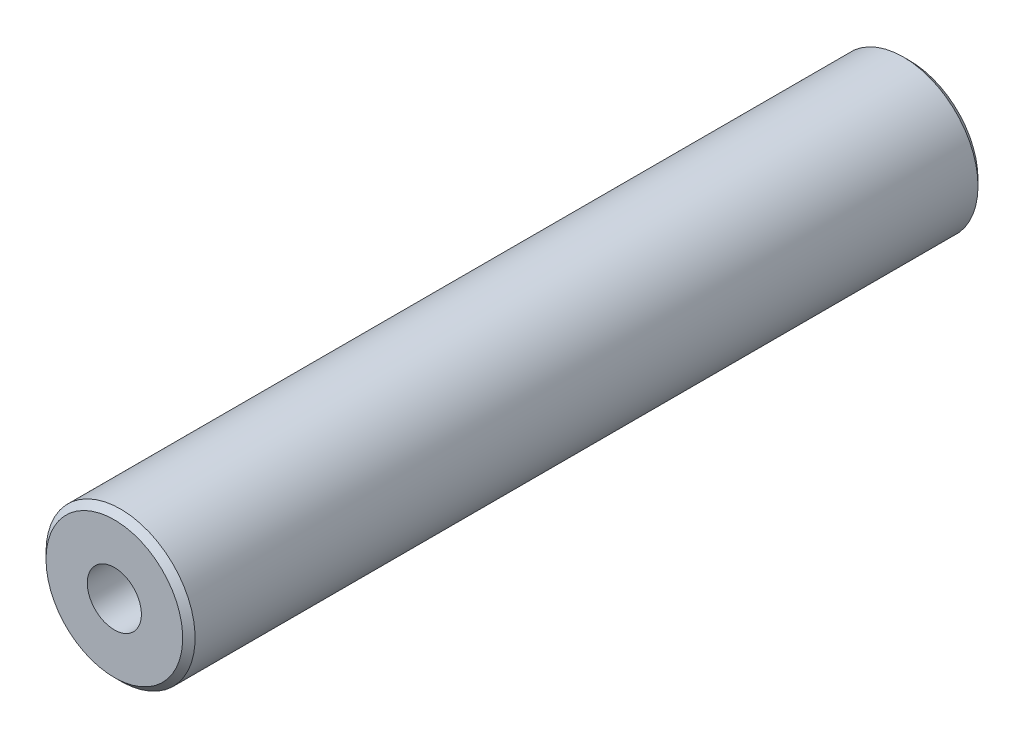
ISO-10303-21;
HEADER;
FILE_DESCRIPTION(('STEP AP214'),'2;1');
FILE_NAME('part.step','',(''),(''),'','','');
FILE_SCHEMA(('AUTOMOTIVE_DESIGN { 1 0 10303 214 1 1 1 1 }'));
ENDSEC;
DATA;
#1=APPLICATION_CONTEXT('core data for automotive mechanical design processes');
#2=APPLICATION_PROTOCOL_DEFINITION('international standard','automotive_design',2000,#1);
#3=PRODUCT_CONTEXT('',#1,'mechanical');
#4=PRODUCT('Part','Part','',(#3));
#5=PRODUCT_RELATED_PRODUCT_CATEGORY('part','',(#4));
#6=PRODUCT_DEFINITION_FORMATION('','',#4);
#7=PRODUCT_DEFINITION_CONTEXT('part definition',#1,'design');
#8=PRODUCT_DEFINITION('design','',#6,#7);
#9=PRODUCT_DEFINITION_SHAPE('','',#8);
#10=(LENGTH_UNIT() NAMED_UNIT(*) SI_UNIT(.MILLI.,.METRE.));
#11=(NAMED_UNIT(*) PLANE_ANGLE_UNIT() SI_UNIT($,.RADIAN.));
#12=(NAMED_UNIT(*) SI_UNIT($,.STERADIAN.) SOLID_ANGLE_UNIT());
#13=UNCERTAINTY_MEASURE_WITH_UNIT(LENGTH_MEASURE(1.E-05),#10,'distance_accuracy_value','');
#14=(GEOMETRIC_REPRESENTATION_CONTEXT(3) GLOBAL_UNCERTAINTY_ASSIGNED_CONTEXT((#13)) GLOBAL_UNIT_ASSIGNED_CONTEXT((#10,
#11,#12)) REPRESENTATION_CONTEXT('',''));
#15=CARTESIAN_POINT('',(0.,0.,0.));
#16=DIRECTION('',(0.,0.,1.));
#17=DIRECTION('',(1.,0.,0.));
#18=AXIS2_PLACEMENT_3D('',#15,#16,#17);
#19=CARTESIAN_POINT('',(0.,0.,25.4));
#20=DIRECTION('',(0.,0.,-1.));
#21=DIRECTION('',(-1.,0.,0.));
#22=AXIS2_PLACEMENT_3D('',#19,#20,#21);
#23=CYLINDRICAL_SURFACE('',#22,4.7625);
#24=CARTESIAN_POINT('',(0.,0.,-25.003125));
#25=DIRECTION('',(0.,0.,1.));
#26=DIRECTION('',(1.,0.,0.));
#27=AXIS2_PLACEMENT_3D('',#24,#25,#26);
#28=CIRCLE('',#27,4.7625);
#29=CARTESIAN_POINT('',(4.7625,0.,-25.003125));
#30=VERTEX_POINT('',#29);
#31=EDGE_CURVE('E73',#30,#30,#28,.T.);
#32=ORIENTED_EDGE('',*,*,#31,.T.);
#33=EDGE_LOOP('',(#32));
#34=FACE_BOUND('',#33,.T.);
#35=CARTESIAN_POINT('',(0.,0.,25.003125));
#36=DIRECTION('',(0.,0.,1.));
#37=DIRECTION('',(1.,0.,0.));
#38=AXIS2_PLACEMENT_3D('',#35,#36,#37);
#39=CIRCLE('',#38,4.7625);
#40=CARTESIAN_POINT('',(-4.7625,0.,25.003125));
#41=VERTEX_POINT('',#40);
#42=EDGE_CURVE('E70',#41,#41,#39,.F.);
#43=ORIENTED_EDGE('',*,*,#42,.T.);
#44=EDGE_LOOP('',(#43));
#45=FACE_BOUND('',#44,.T.);
#46=ADVANCED_FACE('F35',(#34,#45),#23,.T.);
#47=CARTESIAN_POINT('',(0.,0.,25.4));
#48=DIRECTION('',(0.,0.,1.));
#49=DIRECTION('',(1.,0.,0.));
#50=AXIS2_PLACEMENT_3D('',#47,#48,#49);
#51=PLANE('',#50);
#52=CARTESIAN_POINT('',(0.,0.,25.4));
#53=DIRECTION('',(0.,0.,1.));
#54=DIRECTION('',(1.,0.,0.));
#55=AXIS2_PLACEMENT_3D('',#52,#53,#54);
#56=CIRCLE('',#55,4.365625);
#57=CARTESIAN_POINT('',(-4.36562500000001,0.,25.4));
#58=VERTEX_POINT('',#57);
#59=EDGE_CURVE('E11',#58,#58,#56,.T.);
#60=ORIENTED_EDGE('',*,*,#59,.T.);
#61=EDGE_LOOP('',(#60));
#62=FACE_BOUND('',#61,.T.);
#63=CARTESIAN_POINT('',(0.,0.,25.4));
#64=DIRECTION('',(0.,0.,1.));
#65=DIRECTION('',(1.,0.,0.));
#66=AXIS2_PLACEMENT_3D('',#63,#64,#65);
#67=CIRCLE('',#66,1.72719999999999);
#68=CARTESIAN_POINT('',(1.72719999999999,0.,25.4));
#69=VERTEX_POINT('',#68);
#70=EDGE_CURVE('E60',#69,#69,#67,.T.);
#71=ORIENTED_EDGE('',*,*,#70,.F.);
#72=EDGE_LOOP('',(#71));
#73=FACE_BOUND('',#72,.T.);
#74=ADVANCED_FACE('F88',(#62,#73),#51,.T.);
#75=CARTESIAN_POINT('',(0.,0.,-25.4));
#76=DIRECTION('',(0.,0.,1.));
#77=DIRECTION('',(1.,0.,0.));
#78=AXIS2_PLACEMENT_3D('',#75,#76,#77);
#79=PLANE('',#78);
#80=CARTESIAN_POINT('',(0.,0.,-25.4));
#81=DIRECTION('',(0.,0.,1.));
#82=DIRECTION('',(1.,0.,0.));
#83=AXIS2_PLACEMENT_3D('',#80,#81,#82);
#84=CIRCLE('',#83,4.365625);
#85=CARTESIAN_POINT('',(4.365625,0.,-25.4));
#86=VERTEX_POINT('',#85);
#87=EDGE_CURVE('E43',#86,#86,#84,.F.);
#88=ORIENTED_EDGE('',*,*,#87,.T.);
#89=EDGE_LOOP('',(#88));
#90=FACE_BOUND('',#89,.T.);
#91=CARTESIAN_POINT('',(0.,0.,-25.4));
#92=DIRECTION('',(0.,0.,-1.));
#93=DIRECTION('',(-1.,0.,0.));
#94=AXIS2_PLACEMENT_3D('',#91,#92,#93);
#95=CIRCLE('',#94,1.72719999999999);
#96=CARTESIAN_POINT('',(-1.72719999999999,0.,-25.4));
#97=VERTEX_POINT('',#96);
#98=EDGE_CURVE('E59',#97,#97,#95,.T.);
#99=ORIENTED_EDGE('',*,*,#98,.F.);
#100=EDGE_LOOP('',(#99));
#101=FACE_BOUND('',#100,.T.);
#102=ADVANCED_FACE('F78',(#90,#101),#79,.F.);
#103=CARTESIAN_POINT('',(0.,0.,-19.05));
#104=DIRECTION('',(0.,0.,-1.));
#105=DIRECTION('',(-1.,0.,0.));
#106=AXIS2_PLACEMENT_3D('',#103,#104,#105);
#107=CONICAL_SURFACE('',#106,1.72719999999999,1.02974425867665);
#108=CARTESIAN_POINT('',(0.,0.,-18.0121935388156));
#109=VERTEX_POINT('',#108);
#110=VERTEX_LOOP('',#109);
#111=FACE_BOUND('',#110,.T.);
#112=CARTESIAN_POINT('',(0.,0.,-19.05));
#113=DIRECTION('',(0.,0.,-1.));
#114=DIRECTION('',(-1.,0.,0.));
#115=AXIS2_PLACEMENT_3D('',#112,#113,#114);
#116=CIRCLE('',#115,1.72719999999999);
#117=CARTESIAN_POINT('',(-1.72719999999999,0.,-19.05));
#118=VERTEX_POINT('',#117);
#119=EDGE_CURVE('E63',#118,#118,#116,.T.);
#120=ORIENTED_EDGE('',*,*,#119,.T.);
#121=EDGE_LOOP('',(#120));
#122=FACE_BOUND('',#121,.T.);
#123=ADVANCED_FACE('F108',(#111,#122),#107,.F.);
#124=CARTESIAN_POINT('',(0.,0.,-25.4));
#125=DIRECTION('',(0.,0.,-1.));
#126=DIRECTION('',(-1.,0.,0.));
#127=AXIS2_PLACEMENT_3D('',#124,#125,#126);
#128=CYLINDRICAL_SURFACE('',#127,1.72719999999999);
#129=ORIENTED_EDGE('',*,*,#119,.F.);
#130=EDGE_LOOP('',(#129));
#131=FACE_BOUND('',#130,.T.);
#132=ORIENTED_EDGE('',*,*,#98,.T.);
#133=EDGE_LOOP('',(#132));
#134=FACE_BOUND('',#133,.T.);
#135=ADVANCED_FACE('F53',(#131,#134),#128,.F.);
#136=CARTESIAN_POINT('',(0.,0.,19.05));
#137=DIRECTION('',(0.,0.,1.));
#138=DIRECTION('',(1.,0.,0.));
#139=AXIS2_PLACEMENT_3D('',#136,#137,#138);
#140=CONICAL_SURFACE('',#139,1.72719999999999,1.02974425867665);
#141=CARTESIAN_POINT('',(0.,0.,18.0121935388156));
#142=VERTEX_POINT('',#141);
#143=VERTEX_LOOP('',#142);
#144=FACE_BOUND('',#143,.T.);
#145=CARTESIAN_POINT('',(0.,0.,19.05));
#146=DIRECTION('',(0.,0.,1.));
#147=DIRECTION('',(1.,0.,0.));
#148=AXIS2_PLACEMENT_3D('',#145,#146,#147);
#149=CIRCLE('',#148,1.72719999999999);
#150=CARTESIAN_POINT('',(1.72719999999999,0.,19.05));
#151=VERTEX_POINT('',#150);
#152=EDGE_CURVE('E57',#151,#151,#149,.T.);
#153=ORIENTED_EDGE('',*,*,#152,.T.);
#154=EDGE_LOOP('',(#153));
#155=FACE_BOUND('',#154,.T.);
#156=ADVANCED_FACE('F49',(#144,#155),#140,.F.);
#157=CARTESIAN_POINT('',(0.,0.,25.4));
#158=DIRECTION('',(0.,0.,1.));
#159=DIRECTION('',(1.,0.,0.));
#160=AXIS2_PLACEMENT_3D('',#157,#158,#159);
#161=CYLINDRICAL_SURFACE('',#160,1.72719999999999);
#162=ORIENTED_EDGE('',*,*,#152,.F.);
#163=EDGE_LOOP('',(#162));
#164=FACE_BOUND('',#163,.T.);
#165=ORIENTED_EDGE('',*,*,#70,.T.);
#166=EDGE_LOOP('',(#165));
#167=FACE_BOUND('',#166,.T.);
#168=ADVANCED_FACE('F52',(#164,#167),#161,.F.);
#169=CARTESIAN_POINT('',(0.,0.,-25.003125));
#170=DIRECTION('',(0.,0.,1.));
#171=DIRECTION('',(1.,0.,0.));
#172=AXIS2_PLACEMENT_3D('',#169,#170,#171);
#173=CONICAL_SURFACE('',#172,4.7625,0.785398163397454);
#174=ORIENTED_EDGE('',*,*,#87,.F.);
#175=EDGE_LOOP('',(#174));
#176=FACE_BOUND('',#175,.T.);
#177=ORIENTED_EDGE('',*,*,#31,.F.);
#178=EDGE_LOOP('',(#177));
#179=FACE_BOUND('',#178,.T.);
#180=ADVANCED_FACE('F81',(#176,#179),#173,.T.);
#181=CARTESIAN_POINT('',(0.,0.,25.4));
#182=DIRECTION('',(0.,0.,-1.));
#183=DIRECTION('',(-1.,0.,0.));
#184=AXIS2_PLACEMENT_3D('',#181,#182,#183);
#185=CONICAL_SURFACE('',#184,4.365625,0.785398163397441);
#186=CARTESIAN_POINT('',(-4.7625,0.,25.003125));
#187=CARTESIAN_POINT('',(-4.75836588541667,0.,25.0072591145833));
#188=CARTESIAN_POINT('',(-4.75423177083334,0.,25.0113932291667));
#189=CARTESIAN_POINT('',(-4.74596354166667,0.,25.0196614583333));
#190=CARTESIAN_POINT('',(-4.74182942708333,0.,25.0237955729167));
#191=CARTESIAN_POINT('',(-4.73356119791667,0.,25.0320638020833));
#192=CARTESIAN_POINT('',(-4.72942708333334,0.,25.0361979166667));
#193=CARTESIAN_POINT('',(-4.72115885416667,0.,25.0444661458333));
#194=CARTESIAN_POINT('',(-4.71702473958334,0.,25.0486002604167));
#195=CARTESIAN_POINT('',(-4.70875651041667,0.,25.0568684895833));
#196=CARTESIAN_POINT('',(-4.70462239583334,0.,25.0610026041667));
#197=CARTESIAN_POINT('',(-4.69635416666667,0.,25.0692708333333));
#198=CARTESIAN_POINT('',(-4.69222005208334,0.,25.0734049479167));
#199=CARTESIAN_POINT('',(-4.68395182291667,0.,25.0816731770833));
#200=CARTESIAN_POINT('',(-4.67981770833334,0.,25.0858072916667));
#201=CARTESIAN_POINT('',(-4.67154947916667,0.,25.0940755208333));
#202=CARTESIAN_POINT('',(-4.66741536458334,0.,25.0982096354167));
#203=CARTESIAN_POINT('',(-4.65914713541667,0.,25.1064778645833));
#204=CARTESIAN_POINT('',(-4.65501302083334,0.,25.1106119791667));
#205=CARTESIAN_POINT('',(-4.64674479166667,0.,25.1188802083333));
#206=CARTESIAN_POINT('',(-4.64261067708334,0.,25.1230143229167));
#207=CARTESIAN_POINT('',(-4.63434244791667,0.,25.1312825520833));
#208=CARTESIAN_POINT('',(-4.63020833333334,0.,25.1354166666667));
#209=CARTESIAN_POINT('',(-4.62194010416667,0.,25.1436848958333));
#210=CARTESIAN_POINT('',(-4.61780598958334,0.,25.1478190104167));
#211=CARTESIAN_POINT('',(-4.60953776041667,0.,25.1560872395833));
#212=CARTESIAN_POINT('',(-4.60540364583334,0.,25.1602213541667));
#213=CARTESIAN_POINT('',(-4.59713541666667,0.,25.1684895833333));
#214=CARTESIAN_POINT('',(-4.59300130208334,0.,25.1726236979167));
#215=CARTESIAN_POINT('',(-4.58473307291667,0.,25.1808919270833));
#216=CARTESIAN_POINT('',(-4.58059895833334,0.,25.1850260416667));
#217=CARTESIAN_POINT('',(-4.57233072916667,0.,25.1932942708333));
#218=CARTESIAN_POINT('',(-4.56819661458334,0.,25.1974283854167));
#219=CARTESIAN_POINT('',(-4.55992838541667,0.,25.2056966145833));
#220=CARTESIAN_POINT('',(-4.55579427083334,0.,25.2098307291667));
#221=CARTESIAN_POINT('',(-4.54752604166667,0.,25.2180989583333));
#222=CARTESIAN_POINT('',(-4.54339192708334,0.,25.2222330729167));
#223=CARTESIAN_POINT('',(-4.53512369791667,0.,25.2305013020833));
#224=CARTESIAN_POINT('',(-4.53098958333334,0.,25.2346354166667));
#225=CARTESIAN_POINT('',(-4.52272135416667,0.,25.2429036458333));
#226=CARTESIAN_POINT('',(-4.51858723958334,0.,25.2470377604167));
#227=CARTESIAN_POINT('',(-4.51031901041667,0.,25.2553059895833));
#228=CARTESIAN_POINT('',(-4.50618489583334,0.,25.2594401041667));
#229=CARTESIAN_POINT('',(-4.49791666666667,0.,25.2677083333333));
#230=CARTESIAN_POINT('',(-4.49378255208334,0.,25.2718424479167));
#231=CARTESIAN_POINT('',(-4.48551432291667,0.,25.2801106770833));
#232=CARTESIAN_POINT('',(-4.48138020833334,0.,25.2842447916667));
#233=CARTESIAN_POINT('',(-4.47311197916667,0.,25.2925130208333));
#234=CARTESIAN_POINT('',(-4.46897786458334,0.,25.2966471354167));
#235=CARTESIAN_POINT('',(-4.46070963541667,0.,25.3049153645833));
#236=CARTESIAN_POINT('',(-4.45657552083334,0.,25.3090494791667));
#237=CARTESIAN_POINT('',(-4.44830729166667,0.,25.3173177083333));
#238=CARTESIAN_POINT('',(-4.44417317708334,0.,25.3214518229167));
#239=CARTESIAN_POINT('',(-4.43590494791667,0.,25.3297200520833));
#240=CARTESIAN_POINT('',(-4.43177083333334,0.,25.3338541666667));
#241=CARTESIAN_POINT('',(-4.42350260416667,0.,25.3421223958333));
#242=CARTESIAN_POINT('',(-4.41936848958334,0.,25.3462565104167));
#243=CARTESIAN_POINT('',(-4.41110026041667,0.,25.3545247395833));
#244=CARTESIAN_POINT('',(-4.40696614583334,0.,25.3586588541667));
#245=CARTESIAN_POINT('',(-4.39869791666667,0.,25.3669270833333));
#246=CARTESIAN_POINT('',(-4.39456380208334,0.,25.3710611979167));
#247=CARTESIAN_POINT('',(-4.38629557291667,0.,25.3793294270833));
#248=CARTESIAN_POINT('',(-4.38216145833334,0.,25.3834635416667));
#249=CARTESIAN_POINT('',(-4.37389322916667,0.,25.3917317708333));
#250=CARTESIAN_POINT('',(-4.36975911458334,0.,25.3958658854167));
#251=CARTESIAN_POINT('',(-4.36562500000001,0.,25.4));
#252=B_SPLINE_CURVE_WITH_KNOTS('',3,(#186,#187,#188,#189,#190,#191,#192,#193,#194,#195,#196,
#197,#198,#199,#200,#201,#202,#203,#204,#205,#206,#207,#208,#209,#210,#211,#212,#213,#214,#215,
#216,#217,#218,#219,#220,#221,#222,#223,#224,#225,#226,#227,#228,#229,#230,#231,#232,#233,#234,
#235,#236,#237,#238,#239,#240,#241,#242,#243,#244,#245,#246,#247,#248,#249,#250,#251),
.UNSPECIFIED.,.F.,.F.,(4,2,2,2,2,2,2,2,2,2,2,2,2,2,2,2,2,2,2,2,2,2,2,2,2,2,2,2,2,2,2,2,4),(0.,
0.0175395627364622,0.0350791254729244,0.052618688209389,0.0701582509458518,0.087697813682314,
0.105237376418779,0.122776939155241,0.140316501891703,0.157856064628168,0.17539562736463,
0.192935190101093,0.210474752837557,0.228014315574019,0.245553878310482,0.263093441046946,
0.280633003783409,0.298172566519871,0.315712129256336,0.333251691992798,0.35079125472926,
0.368330817465725,0.385870380202187,0.40340994293865,0.420949505675115,0.438489068411577,
0.456028631148039,0.473568193884504,0.491107756620966,0.508647319357428,0.526186882093893,
0.543726444830355,0.56126600756682),.UNSPECIFIED.);
#253=EDGE_CURVE('BSEAM37',#41,#58,#252,.T.);
#254=ORIENTED_EDGE('',*,*,#42,.F.);
#255=ORIENTED_EDGE('',*,*,#59,.F.);
#256=ORIENTED_EDGE('',*,*,#253,.T.);
#257=ORIENTED_EDGE('',*,*,#253,.F.);
#258=EDGE_LOOP('',(#254,#256,#255,#257));
#259=FACE_BOUND('',#258,.T.);
#260=ADVANCED_FACE('F37',(#259),#185,.T.);
#261=CLOSED_SHELL('',(#46,#74,#102,#123,#135,#156,#168,#180,#260));
#262=MANIFOLD_SOLID_BREP('B2',#261);
#263=ADVANCED_BREP_SHAPE_REPRESENTATION('',(#18,#262),#14);
#264=SHAPE_DEFINITION_REPRESENTATION(#9,#263);
ENDSEC;
END-ISO-10303-21;
